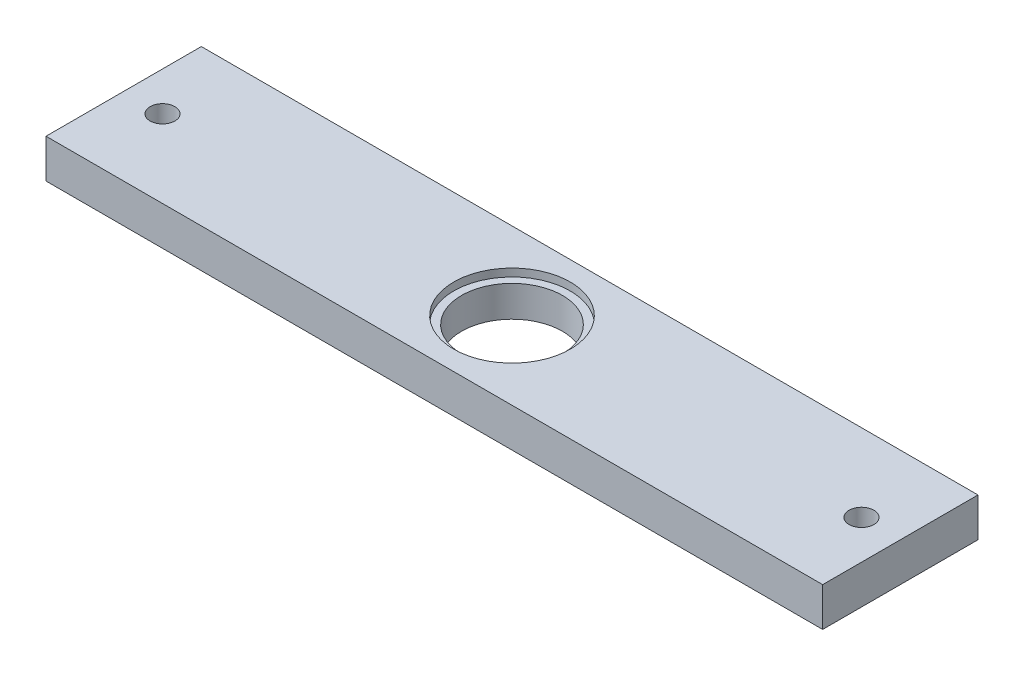
ISO-10303-21;
HEADER;
FILE_DESCRIPTION(('STEP AP214'),'2;1');
FILE_NAME('part.step','',(''),(''),'','','');
FILE_SCHEMA(('AUTOMOTIVE_DESIGN { 1 0 10303 214 1 1 1 1 }'));
ENDSEC;
DATA;
#1=APPLICATION_CONTEXT('core data for automotive mechanical design processes');
#2=APPLICATION_PROTOCOL_DEFINITION('international standard','automotive_design',2000,#1);
#3=PRODUCT_CONTEXT('',#1,'mechanical');
#4=PRODUCT('Part','Part','',(#3));
#5=PRODUCT_RELATED_PRODUCT_CATEGORY('part','',(#4));
#6=PRODUCT_DEFINITION_FORMATION('','',#4);
#7=PRODUCT_DEFINITION_CONTEXT('part definition',#1,'design');
#8=PRODUCT_DEFINITION('design','',#6,#7);
#9=PRODUCT_DEFINITION_SHAPE('','',#8);
#10=(LENGTH_UNIT() NAMED_UNIT(*) SI_UNIT(.MILLI.,.METRE.));
#11=(NAMED_UNIT(*) PLANE_ANGLE_UNIT() SI_UNIT($,.RADIAN.));
#12=(NAMED_UNIT(*) SI_UNIT($,.STERADIAN.) SOLID_ANGLE_UNIT());
#13=UNCERTAINTY_MEASURE_WITH_UNIT(LENGTH_MEASURE(1.E-05),#10,'distance_accuracy_value','');
#14=(GEOMETRIC_REPRESENTATION_CONTEXT(3) GLOBAL_UNCERTAINTY_ASSIGNED_CONTEXT((#13)) GLOBAL_UNIT_ASSIGNED_CONTEXT((#10,
#11,#12)) REPRESENTATION_CONTEXT('',''));
#15=CARTESIAN_POINT('',(0.,0.,0.));
#16=DIRECTION('',(0.,0.,1.));
#17=DIRECTION('',(1.,0.,0.));
#18=AXIS2_PLACEMENT_3D('',#15,#16,#17);
#19=CARTESIAN_POINT('',(0.,5.,0.));
#20=DIRECTION('',(0.,-1.,0.));
#21=DIRECTION('',(0.,0.,-1.));
#22=AXIS2_PLACEMENT_3D('',#19,#20,#21);
#23=CYLINDRICAL_SURFACE('',#22,6.5);
#24=CARTESIAN_POINT('',(0.,0.,0.));
#25=DIRECTION('',(0.,1.,0.));
#26=DIRECTION('',(0.,0.,1.));
#27=AXIS2_PLACEMENT_3D('',#24,#25,#26);
#28=CIRCLE('',#27,6.5);
#29=CARTESIAN_POINT('',(0.,0.,6.5));
#30=VERTEX_POINT('',#29);
#31=EDGE_CURVE('E126',#30,#30,#28,.T.);
#32=ORIENTED_EDGE('',*,*,#31,.F.);
#33=EDGE_LOOP('',(#32));
#34=FACE_BOUND('',#33,.T.);
#35=CARTESIAN_POINT('',(0.,4.,0.));
#36=DIRECTION('',(0.,1.,0.));
#37=DIRECTION('',(0.,0.,1.));
#38=AXIS2_PLACEMENT_3D('',#35,#36,#37);
#39=CIRCLE('',#38,6.5);
#40=CARTESIAN_POINT('',(0.,4.,6.5));
#41=VERTEX_POINT('',#40);
#42=EDGE_CURVE('E39',#41,#41,#39,.T.);
#43=ORIENTED_EDGE('',*,*,#42,.T.);
#44=EDGE_LOOP('',(#43));
#45=FACE_BOUND('',#44,.T.);
#46=ADVANCED_FACE('F35',(#34,#45),#23,.F.);
#47=CARTESIAN_POINT('',(0.,5.,0.));
#48=DIRECTION('',(0.,-1.,0.));
#49=DIRECTION('',(0.,0.,-1.));
#50=AXIS2_PLACEMENT_3D('',#47,#48,#49);
#51=PLANE('',#50);
#52=CARTESIAN_POINT('',(0.,5.,0.));
#53=DIRECTION('',(0.,1.,0.));
#54=DIRECTION('',(0.,0.,1.));
#55=AXIS2_PLACEMENT_3D('',#52,#53,#54);
#56=CIRCLE('',#55,7.5);
#57=CARTESIAN_POINT('',(0.,5.,7.5));
#58=VERTEX_POINT('',#57);
#59=EDGE_CURVE('E131',#58,#58,#56,.T.);
#60=ORIENTED_EDGE('',*,*,#59,.F.);
#61=EDGE_LOOP('',(#60));
#62=FACE_BOUND('',#61,.T.);
#63=DIRECTION('',(0.,0.,-1.));
#64=VECTOR('',#63,1.);
#65=CARTESIAN_POINT('',(50.,5.,10.));
#66=LINE('',#65,#64);
#67=CARTESIAN_POINT('',(50.,5.,10.));
#68=VERTEX_POINT('',#67);
#69=CARTESIAN_POINT('',(50.,5.,-10.));
#70=VERTEX_POINT('',#69);
#71=EDGE_CURVE('E89',#68,#70,#66,.T.);
#72=ORIENTED_EDGE('',*,*,#71,.T.);
#73=DIRECTION('',(-1.,0.,0.));
#74=VECTOR('',#73,1.);
#75=CARTESIAN_POINT('',(-50.,5.,-10.));
#76=LINE('',#75,#74);
#77=CARTESIAN_POINT('',(-50.,5.,-10.));
#78=VERTEX_POINT('',#77);
#79=EDGE_CURVE('E83',#70,#78,#76,.T.);
#80=ORIENTED_EDGE('',*,*,#79,.T.);
#81=DIRECTION('',(0.,0.,1.));
#82=VECTOR('',#81,1.);
#83=CARTESIAN_POINT('',(-50.,5.,10.));
#84=LINE('',#83,#82);
#85=CARTESIAN_POINT('',(-50.,5.,10.));
#86=VERTEX_POINT('',#85);
#87=EDGE_CURVE('E87',#78,#86,#84,.T.);
#88=ORIENTED_EDGE('',*,*,#87,.T.);
#89=DIRECTION('',(1.,0.,0.));
#90=VECTOR('',#89,1.);
#91=CARTESIAN_POINT('',(-50.,5.,10.));
#92=LINE('',#91,#90);
#93=EDGE_CURVE('E53',#86,#68,#92,.T.);
#94=ORIENTED_EDGE('',*,*,#93,.T.);
#95=EDGE_LOOP('',(#72,#80,#88,#94));
#96=FACE_BOUND('',#95,.T.);
#97=CARTESIAN_POINT('',(45.,5.,0.));
#98=DIRECTION('',(0.,1.,0.));
#99=DIRECTION('',(0.,0.,1.));
#100=AXIS2_PLACEMENT_3D('',#97,#98,#99);
#101=CIRCLE('',#100,1.6);
#102=CARTESIAN_POINT('',(45.,5.,1.59999999999998));
#103=VERTEX_POINT('',#102);
#104=EDGE_CURVE('E105',#103,#103,#101,.T.);
#105=ORIENTED_EDGE('',*,*,#104,.F.);
#106=EDGE_LOOP('',(#105));
#107=FACE_BOUND('',#106,.T.);
#108=CARTESIAN_POINT('',(-45.,5.,0.));
#109=DIRECTION('',(0.,1.,0.));
#110=DIRECTION('',(0.,0.,1.));
#111=AXIS2_PLACEMENT_3D('',#108,#109,#110);
#112=CIRCLE('',#111,1.6);
#113=CARTESIAN_POINT('',(-45.,5.,1.6));
#114=VERTEX_POINT('',#113);
#115=EDGE_CURVE('E120',#114,#114,#112,.T.);
#116=ORIENTED_EDGE('',*,*,#115,.F.);
#117=EDGE_LOOP('',(#116));
#118=FACE_BOUND('',#117,.T.);
#119=ADVANCED_FACE('F84',(#62,#96,#107,#118),#51,.F.);
#120=CARTESIAN_POINT('',(0.,0.,0.));
#121=DIRECTION('',(0.,-1.,0.));
#122=DIRECTION('',(0.,0.,-1.));
#123=AXIS2_PLACEMENT_3D('',#120,#121,#122);
#124=PLANE('',#123);
#125=CARTESIAN_POINT('',(-45.,0.,0.));
#126=DIRECTION('',(0.,1.,0.));
#127=DIRECTION('',(0.,0.,1.));
#128=AXIS2_PLACEMENT_3D('',#125,#126,#127);
#129=CIRCLE('',#128,1.6);
#130=CARTESIAN_POINT('',(-45.,0.,1.6));
#131=VERTEX_POINT('',#130);
#132=EDGE_CURVE('E123',#131,#131,#129,.T.);
#133=ORIENTED_EDGE('',*,*,#132,.T.);
#134=EDGE_LOOP('',(#133));
#135=FACE_BOUND('',#134,.T.);
#136=DIRECTION('',(0.,0.,-1.));
#137=VECTOR('',#136,1.);
#138=CARTESIAN_POINT('',(50.,0.,10.));
#139=LINE('',#138,#137);
#140=CARTESIAN_POINT('',(50.,0.,10.));
#141=VERTEX_POINT('',#140);
#142=CARTESIAN_POINT('',(50.,0.,-10.));
#143=VERTEX_POINT('',#142);
#144=EDGE_CURVE('E102',#141,#143,#139,.T.);
#145=ORIENTED_EDGE('',*,*,#144,.F.);
#146=DIRECTION('',(1.,0.,0.));
#147=VECTOR('',#146,1.);
#148=CARTESIAN_POINT('',(-50.,0.,10.));
#149=LINE('',#148,#147);
#150=CARTESIAN_POINT('',(-50.,0.,10.));
#151=VERTEX_POINT('',#150);
#152=EDGE_CURVE('E76',#151,#141,#149,.T.);
#153=ORIENTED_EDGE('',*,*,#152,.F.);
#154=DIRECTION('',(0.,0.,1.));
#155=VECTOR('',#154,1.);
#156=CARTESIAN_POINT('',(-50.,0.,10.));
#157=LINE('',#156,#155);
#158=CARTESIAN_POINT('',(-50.,0.,-10.));
#159=VERTEX_POINT('',#158);
#160=EDGE_CURVE('E70',#159,#151,#157,.T.);
#161=ORIENTED_EDGE('',*,*,#160,.F.);
#162=DIRECTION('',(-1.,0.,0.));
#163=VECTOR('',#162,1.);
#164=CARTESIAN_POINT('',(-50.,0.,-10.));
#165=LINE('',#164,#163);
#166=EDGE_CURVE('E93',#143,#159,#165,.T.);
#167=ORIENTED_EDGE('',*,*,#166,.F.);
#168=EDGE_LOOP('',(#145,#153,#161,#167));
#169=FACE_BOUND('',#168,.T.);
#170=CARTESIAN_POINT('',(45.,0.,0.));
#171=DIRECTION('',(0.,1.,0.));
#172=DIRECTION('',(0.,0.,1.));
#173=AXIS2_PLACEMENT_3D('',#170,#171,#172);
#174=CIRCLE('',#173,1.6);
#175=CARTESIAN_POINT('',(45.,0.,1.59999999999998));
#176=VERTEX_POINT('',#175);
#177=EDGE_CURVE('E117',#176,#176,#174,.T.);
#178=ORIENTED_EDGE('',*,*,#177,.T.);
#179=EDGE_LOOP('',(#178));
#180=FACE_BOUND('',#179,.T.);
#181=ORIENTED_EDGE('',*,*,#31,.T.);
#182=EDGE_LOOP('',(#181));
#183=FACE_BOUND('',#182,.T.);
#184=ADVANCED_FACE('F113',(#135,#169,#180,#183),#124,.T.);
#185=CARTESIAN_POINT('',(50.,5.,10.));
#186=DIRECTION('',(-1.,0.,0.));
#187=DIRECTION('',(0.,0.,1.));
#188=AXIS2_PLACEMENT_3D('',#185,#186,#187);
#189=PLANE('',#188);
#190=ORIENTED_EDGE('',*,*,#144,.T.);
#191=DIRECTION('',(0.,-1.,0.));
#192=VECTOR('',#191,1.);
#193=CARTESIAN_POINT('',(50.,5.,-10.));
#194=LINE('',#193,#192);
#195=EDGE_CURVE('E11',#70,#143,#194,.T.);
#196=ORIENTED_EDGE('',*,*,#195,.F.);
#197=ORIENTED_EDGE('',*,*,#71,.F.);
#198=DIRECTION('',(0.,-1.,0.));
#199=VECTOR('',#198,1.);
#200=CARTESIAN_POINT('',(50.,5.,10.));
#201=LINE('',#200,#199);
#202=EDGE_CURVE('E98',#68,#141,#201,.T.);
#203=ORIENTED_EDGE('',*,*,#202,.T.);
#204=EDGE_LOOP('',(#190,#196,#197,#203));
#205=FACE_BOUND('',#204,.T.);
#206=ADVANCED_FACE('F37',(#205),#189,.F.);
#207=CARTESIAN_POINT('',(-50.,5.,-10.));
#208=DIRECTION('',(0.,0.,1.));
#209=DIRECTION('',(1.,0.,0.));
#210=AXIS2_PLACEMENT_3D('',#207,#208,#209);
#211=PLANE('',#210);
#212=ORIENTED_EDGE('',*,*,#166,.T.);
#213=DIRECTION('',(0.,-1.,0.));
#214=VECTOR('',#213,1.);
#215=CARTESIAN_POINT('',(-50.,5.,-10.));
#216=LINE('',#215,#214);
#217=EDGE_CURVE('E45',#78,#159,#216,.T.);
#218=ORIENTED_EDGE('',*,*,#217,.F.);
#219=ORIENTED_EDGE('',*,*,#79,.F.);
#220=ORIENTED_EDGE('',*,*,#195,.T.);
#221=EDGE_LOOP('',(#212,#218,#219,#220));
#222=FACE_BOUND('',#221,.T.);
#223=ADVANCED_FACE('F92',(#222),#211,.F.);
#224=CARTESIAN_POINT('',(-50.,5.,10.));
#225=DIRECTION('',(1.,0.,0.));
#226=DIRECTION('',(0.,0.,-1.));
#227=AXIS2_PLACEMENT_3D('',#224,#225,#226);
#228=PLANE('',#227);
#229=ORIENTED_EDGE('',*,*,#160,.T.);
#230=DIRECTION('',(0.,-1.,0.));
#231=VECTOR('',#230,1.);
#232=CARTESIAN_POINT('',(-50.,5.,10.));
#233=LINE('',#232,#231);
#234=EDGE_CURVE('E94',#86,#151,#233,.T.);
#235=ORIENTED_EDGE('',*,*,#234,.F.);
#236=ORIENTED_EDGE('',*,*,#87,.F.);
#237=ORIENTED_EDGE('',*,*,#217,.T.);
#238=EDGE_LOOP('',(#229,#235,#236,#237));
#239=FACE_BOUND('',#238,.T.);
#240=ADVANCED_FACE('F96',(#239),#228,.F.);
#241=CARTESIAN_POINT('',(-50.,5.,10.));
#242=DIRECTION('',(0.,0.,-1.));
#243=DIRECTION('',(-1.,0.,0.));
#244=AXIS2_PLACEMENT_3D('',#241,#242,#243);
#245=PLANE('',#244);
#246=ORIENTED_EDGE('',*,*,#152,.T.);
#247=ORIENTED_EDGE('',*,*,#202,.F.);
#248=ORIENTED_EDGE('',*,*,#93,.F.);
#249=ORIENTED_EDGE('',*,*,#234,.T.);
#250=EDGE_LOOP('',(#246,#247,#248,#249));
#251=FACE_BOUND('',#250,.T.);
#252=ADVANCED_FACE('F110',(#251),#245,.F.);
#253=CARTESIAN_POINT('',(45.,5.,0.));
#254=DIRECTION('',(0.,-1.,0.));
#255=DIRECTION('',(0.,0.,-1.));
#256=AXIS2_PLACEMENT_3D('',#253,#254,#255);
#257=CYLINDRICAL_SURFACE('',#256,1.6);
#258=ORIENTED_EDGE('',*,*,#104,.T.);
#259=EDGE_LOOP('',(#258));
#260=FACE_BOUND('',#259,.T.);
#261=ORIENTED_EDGE('',*,*,#177,.F.);
#262=EDGE_LOOP('',(#261));
#263=FACE_BOUND('',#262,.T.);
#264=ADVANCED_FACE('F165',(#260,#263),#257,.F.);
#265=CARTESIAN_POINT('',(-45.,5.,0.));
#266=DIRECTION('',(0.,-1.,0.));
#267=DIRECTION('',(0.,0.,-1.));
#268=AXIS2_PLACEMENT_3D('',#265,#266,#267);
#269=CYLINDRICAL_SURFACE('',#268,1.6);
#270=ORIENTED_EDGE('',*,*,#115,.T.);
#271=EDGE_LOOP('',(#270));
#272=FACE_BOUND('',#271,.T.);
#273=ORIENTED_EDGE('',*,*,#132,.F.);
#274=EDGE_LOOP('',(#273));
#275=FACE_BOUND('',#274,.T.);
#276=ADVANCED_FACE('F149',(#272,#275),#269,.F.);
#277=CARTESIAN_POINT('',(0.,4.,0.));
#278=DIRECTION('',(0.,1.,0.));
#279=DIRECTION('',(0.,0.,1.));
#280=AXIS2_PLACEMENT_3D('',#277,#278,#279);
#281=CYLINDRICAL_SURFACE('',#280,7.5);
#282=CARTESIAN_POINT('',(0.,4.,0.));
#283=DIRECTION('',(0.,1.,0.));
#284=DIRECTION('',(0.,0.,1.));
#285=AXIS2_PLACEMENT_3D('',#282,#283,#284);
#286=CIRCLE('',#285,7.5);
#287=CARTESIAN_POINT('',(0.,4.,7.5));
#288=VERTEX_POINT('',#287);
#289=EDGE_CURVE('E134',#288,#288,#286,.T.);
#290=ORIENTED_EDGE('',*,*,#289,.F.);
#291=EDGE_LOOP('',(#290));
#292=FACE_BOUND('',#291,.T.);
#293=ORIENTED_EDGE('',*,*,#59,.T.);
#294=EDGE_LOOP('',(#293));
#295=FACE_BOUND('',#294,.T.);
#296=ADVANCED_FACE('F144',(#292,#295),#281,.F.);
#297=CARTESIAN_POINT('',(0.,4.,0.));
#298=DIRECTION('',(0.,1.,0.));
#299=DIRECTION('',(0.,0.,1.));
#300=AXIS2_PLACEMENT_3D('',#297,#298,#299);
#301=PLANE('',#300);
#302=ORIENTED_EDGE('',*,*,#42,.F.);
#303=EDGE_LOOP('',(#302));
#304=FACE_BOUND('',#303,.T.);
#305=ORIENTED_EDGE('',*,*,#289,.T.);
#306=EDGE_LOOP('',(#305));
#307=FACE_BOUND('',#306,.T.);
#308=ADVANCED_FACE('F142',(#304,#307),#301,.T.);
#309=CLOSED_SHELL('',(#46,#119,#184,#206,#223,#240,#252,#264,#276,#296,#308));
#310=MANIFOLD_SOLID_BREP('B2',#309);
#311=ADVANCED_BREP_SHAPE_REPRESENTATION('',(#18,#310),#14);
#312=SHAPE_DEFINITION_REPRESENTATION(#9,#311);
ENDSEC;
END-ISO-10303-21;
